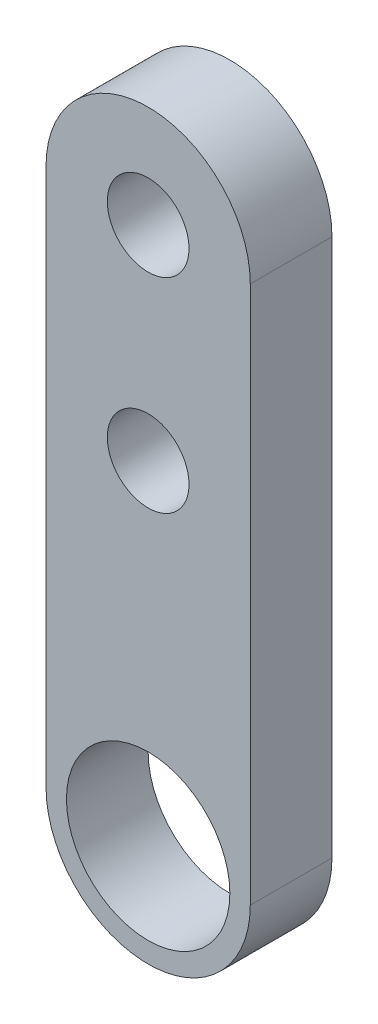
ISO-10303-21;
HEADER;
FILE_DESCRIPTION(('STEP AP214'),'2;1');
FILE_NAME('part.step','',(''),(''),'','','');
FILE_SCHEMA(('AUTOMOTIVE_DESIGN { 1 0 10303 214 1 1 1 1 }'));
ENDSEC;
DATA;
#1=APPLICATION_CONTEXT('core data for automotive mechanical design processes');
#2=APPLICATION_PROTOCOL_DEFINITION('international standard','automotive_design',2000,#1);
#3=PRODUCT_CONTEXT('',#1,'mechanical');
#4=PRODUCT('Part','Part','',(#3));
#5=PRODUCT_RELATED_PRODUCT_CATEGORY('part','',(#4));
#6=PRODUCT_DEFINITION_FORMATION('','',#4);
#7=PRODUCT_DEFINITION_CONTEXT('part definition',#1,'design');
#8=PRODUCT_DEFINITION('design','',#6,#7);
#9=PRODUCT_DEFINITION_SHAPE('','',#8);
#10=(LENGTH_UNIT() NAMED_UNIT(*) SI_UNIT(.MILLI.,.METRE.));
#11=(NAMED_UNIT(*) PLANE_ANGLE_UNIT() SI_UNIT($,.RADIAN.));
#12=(NAMED_UNIT(*) SI_UNIT($,.STERADIAN.) SOLID_ANGLE_UNIT());
#13=UNCERTAINTY_MEASURE_WITH_UNIT(LENGTH_MEASURE(1.E-05),#10,'distance_accuracy_value','');
#14=(GEOMETRIC_REPRESENTATION_CONTEXT(3) GLOBAL_UNCERTAINTY_ASSIGNED_CONTEXT((#13)) GLOBAL_UNIT_ASSIGNED_CONTEXT((#10,
#11,#12)) REPRESENTATION_CONTEXT('',''));
#15=CARTESIAN_POINT('',(0.,0.,0.));
#16=DIRECTION('',(0.,0.,1.));
#17=DIRECTION('',(1.,0.,0.));
#18=AXIS2_PLACEMENT_3D('',#15,#16,#17);
#19=CARTESIAN_POINT('',(0.,-4.08499999999997,2.));
#20=DIRECTION('',(0.,0.,-1.));
#21=DIRECTION('',(-1.,0.,0.));
#22=AXIS2_PLACEMENT_3D('',#19,#20,#21);
#23=PLANE('',#22);
#24=CARTESIAN_POINT('',(0.,-4.08499999999997,2.));
#25=DIRECTION('',(0.,0.,1.));
#26=DIRECTION('',(-1.,0.,0.));
#27=AXIS2_PLACEMENT_3D('',#24,#25,#26);
#28=CIRCLE('',#27,2.50000000000001);
#29=CARTESIAN_POINT('',(-2.50000000000002,-4.08500000000007,2.));
#30=VERTEX_POINT('',#29);
#31=CARTESIAN_POINT('',(2.5,-4.08499999999997,2.));
#32=VERTEX_POINT('',#31);
#33=EDGE_CURVE('E85',#30,#32,#28,.T.);
#34=ORIENTED_EDGE('',*,*,#33,.T.);
#35=DIRECTION('',(0.,1.,0.));
#36=VECTOR('',#35,1.);
#37=CARTESIAN_POINT('',(2.5,9.08500000000002,2.));
#38=LINE('',#37,#36);
#39=CARTESIAN_POINT('',(2.5,9.08500000000002,2.));
#40=VERTEX_POINT('',#39);
#41=EDGE_CURVE('E80',#32,#40,#38,.T.);
#42=ORIENTED_EDGE('',*,*,#41,.T.);
#43=CARTESIAN_POINT('',(0.,9.08500000000002,2.));
#44=DIRECTION('',(0.,0.,1.));
#45=DIRECTION('',(1.,0.,0.));
#46=AXIS2_PLACEMENT_3D('',#43,#44,#45);
#47=CIRCLE('',#46,2.50000000000001);
#48=CARTESIAN_POINT('',(-2.50000000000002,9.08500000000002,2.));
#49=VERTEX_POINT('',#48);
#50=EDGE_CURVE('E83',#40,#49,#47,.T.);
#51=ORIENTED_EDGE('',*,*,#50,.T.);
#52=DIRECTION('',(0.,-1.,0.));
#53=VECTOR('',#52,1.);
#54=CARTESIAN_POINT('',(-2.50000000000002,9.08500000000002,2.));
#55=LINE('',#54,#53);
#56=EDGE_CURVE('E50',#49,#30,#55,.T.);
#57=ORIENTED_EDGE('',*,*,#56,.T.);
#58=EDGE_LOOP('',(#34,#42,#51,#57));
#59=FACE_BOUND('',#58,.T.);
#60=CARTESIAN_POINT('',(0.,4.08500000000002,2.));
#61=DIRECTION('',(0.,0.,1.));
#62=DIRECTION('',(1.,0.,0.));
#63=AXIS2_PLACEMENT_3D('',#60,#61,#62);
#64=CIRCLE('',#63,1.);
#65=CARTESIAN_POINT('',(1.,4.08500000000002,2.));
#66=VERTEX_POINT('',#65);
#67=EDGE_CURVE('E100',#66,#66,#64,.T.);
#68=ORIENTED_EDGE('',*,*,#67,.F.);
#69=EDGE_LOOP('',(#68));
#70=FACE_BOUND('',#69,.T.);
#71=CARTESIAN_POINT('',(0.,-4.08499999999997,2.));
#72=DIRECTION('',(0.,0.,1.));
#73=DIRECTION('',(1.,0.,0.));
#74=AXIS2_PLACEMENT_3D('',#71,#72,#73);
#75=CIRCLE('',#74,2.);
#76=CARTESIAN_POINT('',(2.,-4.08499999999997,2.));
#77=VERTEX_POINT('',#76);
#78=EDGE_CURVE('E115',#77,#77,#75,.T.);
#79=ORIENTED_EDGE('',*,*,#78,.F.);
#80=EDGE_LOOP('',(#79));
#81=FACE_BOUND('',#80,.T.);
#82=CARTESIAN_POINT('',(0.,9.08500000000002,2.));
#83=DIRECTION('',(0.,0.,1.));
#84=DIRECTION('',(1.,0.,0.));
#85=AXIS2_PLACEMENT_3D('',#82,#83,#84);
#86=CIRCLE('',#85,1.);
#87=CARTESIAN_POINT('',(0.999999999999996,9.08500000000002,2.));
#88=VERTEX_POINT('',#87);
#89=EDGE_CURVE('E121',#88,#88,#86,.T.);
#90=ORIENTED_EDGE('',*,*,#89,.F.);
#91=EDGE_LOOP('',(#90));
#92=FACE_BOUND('',#91,.T.);
#93=ADVANCED_FACE('F33',(#59,#70,#81,#92),#23,.F.);
#94=CARTESIAN_POINT('',(0.,-4.08499999999997,0.));
#95=DIRECTION('',(0.,0.,-1.));
#96=DIRECTION('',(-1.,0.,0.));
#97=AXIS2_PLACEMENT_3D('',#94,#95,#96);
#98=PLANE('',#97);
#99=CARTESIAN_POINT('',(0.,-4.08499999999997,0.));
#100=DIRECTION('',(0.,0.,1.));
#101=DIRECTION('',(1.,0.,0.));
#102=AXIS2_PLACEMENT_3D('',#99,#100,#101);
#103=CIRCLE('',#102,2.);
#104=CARTESIAN_POINT('',(2.,-4.08499999999997,0.));
#105=VERTEX_POINT('',#104);
#106=EDGE_CURVE('E118',#105,#105,#103,.T.);
#107=ORIENTED_EDGE('',*,*,#106,.T.);
#108=EDGE_LOOP('',(#107));
#109=FACE_BOUND('',#108,.T.);
#110=CARTESIAN_POINT('',(0.,-4.08499999999997,0.));
#111=DIRECTION('',(0.,0.,1.));
#112=DIRECTION('',(-1.,0.,0.));
#113=AXIS2_PLACEMENT_3D('',#110,#111,#112);
#114=CIRCLE('',#113,2.50000000000001);
#115=CARTESIAN_POINT('',(-2.50000000000002,-4.08500000000007,0.));
#116=VERTEX_POINT('',#115);
#117=CARTESIAN_POINT('',(2.5,-4.08499999999997,0.));
#118=VERTEX_POINT('',#117);
#119=EDGE_CURVE('E97',#116,#118,#114,.T.);
#120=ORIENTED_EDGE('',*,*,#119,.F.);
#121=DIRECTION('',(0.,-1.,0.));
#122=VECTOR('',#121,1.);
#123=CARTESIAN_POINT('',(-2.50000000000002,9.08500000000002,0.));
#124=LINE('',#123,#122);
#125=CARTESIAN_POINT('',(-2.50000000000002,9.08500000000002,0.));
#126=VERTEX_POINT('',#125);
#127=EDGE_CURVE('E73',#126,#116,#124,.T.);
#128=ORIENTED_EDGE('',*,*,#127,.F.);
#129=CARTESIAN_POINT('',(0.,9.08500000000002,0.));
#130=DIRECTION('',(0.,0.,1.));
#131=DIRECTION('',(1.,0.,0.));
#132=AXIS2_PLACEMENT_3D('',#129,#130,#131);
#133=CIRCLE('',#132,2.50000000000001);
#134=CARTESIAN_POINT('',(2.5,9.08500000000002,0.));
#135=VERTEX_POINT('',#134);
#136=EDGE_CURVE('E67',#135,#126,#133,.T.);
#137=ORIENTED_EDGE('',*,*,#136,.F.);
#138=DIRECTION('',(0.,1.,0.));
#139=VECTOR('',#138,1.);
#140=CARTESIAN_POINT('',(2.5,9.08500000000002,0.));
#141=LINE('',#140,#139);
#142=EDGE_CURVE('E89',#118,#135,#141,.T.);
#143=ORIENTED_EDGE('',*,*,#142,.F.);
#144=EDGE_LOOP('',(#120,#128,#137,#143));
#145=FACE_BOUND('',#144,.T.);
#146=CARTESIAN_POINT('',(0.,4.08500000000002,0.));
#147=DIRECTION('',(0.,0.,1.));
#148=DIRECTION('',(1.,0.,0.));
#149=AXIS2_PLACEMENT_3D('',#146,#147,#148);
#150=CIRCLE('',#149,1.);
#151=CARTESIAN_POINT('',(1.,4.08500000000002,0.));
#152=VERTEX_POINT('',#151);
#153=EDGE_CURVE('E112',#152,#152,#150,.T.);
#154=ORIENTED_EDGE('',*,*,#153,.T.);
#155=EDGE_LOOP('',(#154));
#156=FACE_BOUND('',#155,.T.);
#157=CARTESIAN_POINT('',(0.,9.08500000000002,0.));
#158=DIRECTION('',(0.,0.,1.));
#159=DIRECTION('',(1.,0.,0.));
#160=AXIS2_PLACEMENT_3D('',#157,#158,#159);
#161=CIRCLE('',#160,1.);
#162=CARTESIAN_POINT('',(0.999999999999996,9.08500000000002,0.));
#163=VERTEX_POINT('',#162);
#164=EDGE_CURVE('E124',#163,#163,#161,.T.);
#165=ORIENTED_EDGE('',*,*,#164,.T.);
#166=EDGE_LOOP('',(#165));
#167=FACE_BOUND('',#166,.T.);
#168=ADVANCED_FACE('F108',(#109,#145,#156,#167),#98,.T.);
#169=CARTESIAN_POINT('',(0.,-4.08499999999997,2.));
#170=DIRECTION('',(0.,0.,-1.));
#171=DIRECTION('',(-1.,0.,0.));
#172=AXIS2_PLACEMENT_3D('',#169,#170,#171);
#173=CYLINDRICAL_SURFACE('',#172,2.50000000000001);
#174=ORIENTED_EDGE('',*,*,#119,.T.);
#175=DIRECTION('',(0.,0.,-1.));
#176=VECTOR('',#175,1.);
#177=CARTESIAN_POINT('',(2.5,-4.08499999999997,2.));
#178=LINE('',#177,#176);
#179=EDGE_CURVE('E11',#32,#118,#178,.T.);
#180=ORIENTED_EDGE('',*,*,#179,.F.);
#181=ORIENTED_EDGE('',*,*,#33,.F.);
#182=DIRECTION('',(0.,0.,-1.));
#183=VECTOR('',#182,1.);
#184=CARTESIAN_POINT('',(-2.50000000000002,-4.08500000000007,2.));
#185=LINE('',#184,#183);
#186=EDGE_CURVE('E93',#30,#116,#185,.T.);
#187=ORIENTED_EDGE('',*,*,#186,.T.);
#188=EDGE_LOOP('',(#174,#180,#181,#187));
#189=FACE_BOUND('',#188,.T.);
#190=ADVANCED_FACE('F35',(#189),#173,.T.);
#191=CARTESIAN_POINT('',(2.5,9.08500000000002,2.));
#192=DIRECTION('',(-1.,0.,0.));
#193=DIRECTION('',(0.,-1.,0.));
#194=AXIS2_PLACEMENT_3D('',#191,#192,#193);
#195=PLANE('',#194);
#196=ORIENTED_EDGE('',*,*,#142,.T.);
#197=DIRECTION('',(0.,0.,-1.));
#198=VECTOR('',#197,1.);
#199=CARTESIAN_POINT('',(2.5,9.08500000000002,2.));
#200=LINE('',#199,#198);
#201=EDGE_CURVE('E42',#40,#135,#200,.T.);
#202=ORIENTED_EDGE('',*,*,#201,.F.);
#203=ORIENTED_EDGE('',*,*,#41,.F.);
#204=ORIENTED_EDGE('',*,*,#179,.T.);
#205=EDGE_LOOP('',(#196,#202,#203,#204));
#206=FACE_BOUND('',#205,.T.);
#207=ADVANCED_FACE('F88',(#206),#195,.F.);
#208=CARTESIAN_POINT('',(0.,9.08500000000002,2.));
#209=DIRECTION('',(0.,0.,-1.));
#210=DIRECTION('',(-1.,0.,0.));
#211=AXIS2_PLACEMENT_3D('',#208,#209,#210);
#212=CYLINDRICAL_SURFACE('',#211,2.50000000000001);
#213=ORIENTED_EDGE('',*,*,#136,.T.);
#214=DIRECTION('',(0.,0.,-1.));
#215=VECTOR('',#214,1.);
#216=CARTESIAN_POINT('',(-2.50000000000002,9.08500000000002,2.));
#217=LINE('',#216,#215);
#218=EDGE_CURVE('E90',#49,#126,#217,.T.);
#219=ORIENTED_EDGE('',*,*,#218,.F.);
#220=ORIENTED_EDGE('',*,*,#50,.F.);
#221=ORIENTED_EDGE('',*,*,#201,.T.);
#222=EDGE_LOOP('',(#213,#219,#220,#221));
#223=FACE_BOUND('',#222,.T.);
#224=ADVANCED_FACE('F91',(#223),#212,.T.);
#225=CARTESIAN_POINT('',(-2.50000000000002,9.08500000000002,2.));
#226=DIRECTION('',(1.,0.,0.));
#227=DIRECTION('',(0.,1.,0.));
#228=AXIS2_PLACEMENT_3D('',#225,#226,#227);
#229=PLANE('',#228);
#230=ORIENTED_EDGE('',*,*,#127,.T.);
#231=ORIENTED_EDGE('',*,*,#186,.F.);
#232=ORIENTED_EDGE('',*,*,#56,.F.);
#233=ORIENTED_EDGE('',*,*,#218,.T.);
#234=EDGE_LOOP('',(#230,#231,#232,#233));
#235=FACE_BOUND('',#234,.T.);
#236=ADVANCED_FACE('F105',(#235),#229,.F.);
#237=CARTESIAN_POINT('',(0.,4.08500000000002,2.));
#238=DIRECTION('',(0.,0.,-1.));
#239=DIRECTION('',(-1.,0.,0.));
#240=AXIS2_PLACEMENT_3D('',#237,#238,#239);
#241=CYLINDRICAL_SURFACE('',#240,1.);
#242=ORIENTED_EDGE('',*,*,#67,.T.);
#243=EDGE_LOOP('',(#242));
#244=FACE_BOUND('',#243,.T.);
#245=ORIENTED_EDGE('',*,*,#153,.F.);
#246=EDGE_LOOP('',(#245));
#247=FACE_BOUND('',#246,.T.);
#248=ADVANCED_FACE('F141',(#244,#247),#241,.F.);
#249=CARTESIAN_POINT('',(0.,-4.08499999999997,2.));
#250=DIRECTION('',(0.,0.,-1.));
#251=DIRECTION('',(-1.,0.,0.));
#252=AXIS2_PLACEMENT_3D('',#249,#250,#251);
#253=CYLINDRICAL_SURFACE('',#252,2.);
#254=ORIENTED_EDGE('',*,*,#78,.T.);
#255=EDGE_LOOP('',(#254));
#256=FACE_BOUND('',#255,.T.);
#257=ORIENTED_EDGE('',*,*,#106,.F.);
#258=EDGE_LOOP('',(#257));
#259=FACE_BOUND('',#258,.T.);
#260=ADVANCED_FACE('F187',(#256,#259),#253,.F.);
#261=CARTESIAN_POINT('',(0.,9.08500000000002,2.));
#262=DIRECTION('',(0.,0.,-1.));
#263=DIRECTION('',(-1.,0.,0.));
#264=AXIS2_PLACEMENT_3D('',#261,#262,#263);
#265=CYLINDRICAL_SURFACE('',#264,1.);
#266=ORIENTED_EDGE('',*,*,#89,.T.);
#267=EDGE_LOOP('',(#266));
#268=FACE_BOUND('',#267,.T.);
#269=ORIENTED_EDGE('',*,*,#164,.F.);
#270=EDGE_LOOP('',(#269));
#271=FACE_BOUND('',#270,.T.);
#272=ADVANCED_FACE('F130',(#268,#271),#265,.F.);
#273=CLOSED_SHELL('',(#93,#168,#190,#207,#224,#236,#248,#260,#272));
#274=MANIFOLD_SOLID_BREP('B2',#273);
#275=ADVANCED_BREP_SHAPE_REPRESENTATION('',(#18,#274),#14);
#276=SHAPE_DEFINITION_REPRESENTATION(#9,#275);
ENDSEC;
END-ISO-10303-21;
